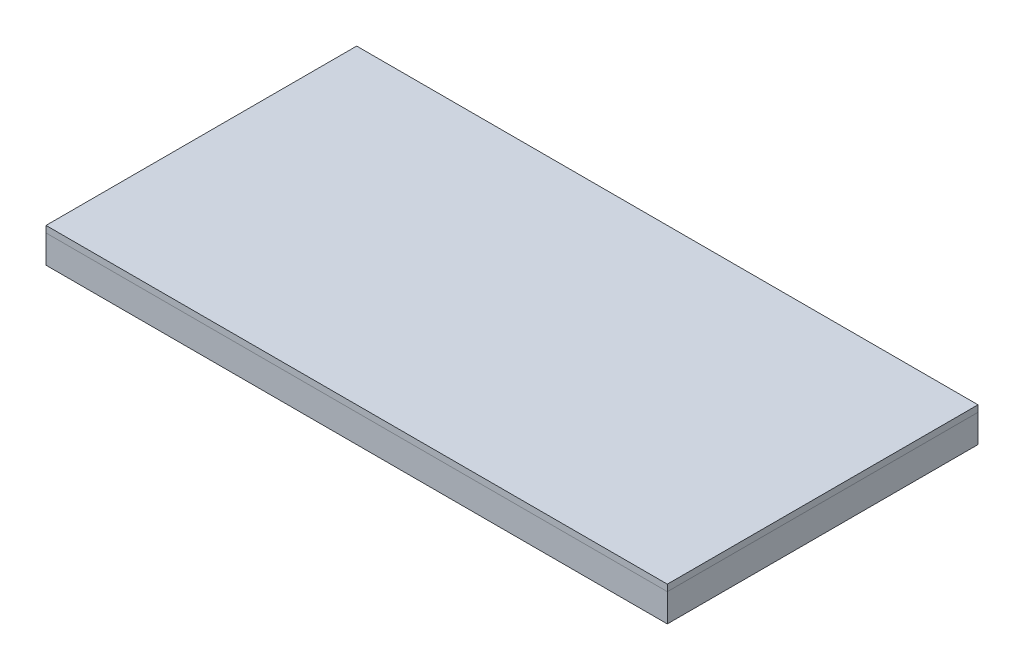
ISO-10303-21;
HEADER;
FILE_DESCRIPTION(('STEP AP214'),'2;1');
FILE_NAME('part.step','',(''),(''),'','','');
FILE_SCHEMA(('AUTOMOTIVE_DESIGN { 1 0 10303 214 1 1 1 1 }'));
ENDSEC;
DATA;
#1=APPLICATION_CONTEXT('core data for automotive mechanical design processes');
#2=APPLICATION_PROTOCOL_DEFINITION('international standard','automotive_design',2000,#1);
#3=PRODUCT_CONTEXT('',#1,'mechanical');
#4=PRODUCT('Part','Part','',(#3));
#5=PRODUCT_RELATED_PRODUCT_CATEGORY('part','',(#4));
#6=PRODUCT_DEFINITION_FORMATION('','',#4);
#7=PRODUCT_DEFINITION_CONTEXT('part definition',#1,'design');
#8=PRODUCT_DEFINITION('design','',#6,#7);
#9=PRODUCT_DEFINITION_SHAPE('','',#8);
#10=(LENGTH_UNIT() NAMED_UNIT(*) SI_UNIT(.MILLI.,.METRE.));
#11=(NAMED_UNIT(*) PLANE_ANGLE_UNIT() SI_UNIT($,.RADIAN.));
#12=(NAMED_UNIT(*) SI_UNIT($,.STERADIAN.) SOLID_ANGLE_UNIT());
#13=UNCERTAINTY_MEASURE_WITH_UNIT(LENGTH_MEASURE(1.E-05),#10,'distance_accuracy_value','');
#14=(GEOMETRIC_REPRESENTATION_CONTEXT(3) GLOBAL_UNCERTAINTY_ASSIGNED_CONTEXT((#13)) GLOBAL_UNIT_ASSIGNED_CONTEXT((#10,
#11,#12)) REPRESENTATION_CONTEXT('',''));
#15=CARTESIAN_POINT('',(0.,0.,0.));
#16=DIRECTION('',(0.,0.,1.));
#17=DIRECTION('',(1.,0.,0.));
#18=AXIS2_PLACEMENT_3D('',#15,#16,#17);
#19=CARTESIAN_POINT('',(0.,-111.,0.));
#20=DIRECTION('',(0.,-1.,0.));
#21=DIRECTION('',(0.,0.,-1.));
#22=AXIS2_PLACEMENT_3D('',#19,#20,#21);
#23=PLANE('',#22);
#24=DIRECTION('',(1.,0.,0.));
#25=VECTOR('',#24,1.);
#26=CARTESIAN_POINT('',(-1000.,-111.,-500.));
#27=LINE('',#26,#25);
#28=CARTESIAN_POINT('',(-1000.,-111.,-500.));
#29=VERTEX_POINT('',#28);
#30=CARTESIAN_POINT('',(1000.,-111.,-500.));
#31=VERTEX_POINT('',#30);
#32=EDGE_CURVE('E143',#29,#31,#27,.T.);
#33=ORIENTED_EDGE('',*,*,#32,.T.);
#34=DIRECTION('',(0.,0.,1.));
#35=VECTOR('',#34,1.);
#36=CARTESIAN_POINT('',(1000.,-111.,-500.));
#37=LINE('',#36,#35);
#38=CARTESIAN_POINT('',(1000.,-111.,500.));
#39=VERTEX_POINT('',#38);
#40=EDGE_CURVE('E146',#31,#39,#37,.T.);
#41=ORIENTED_EDGE('',*,*,#40,.T.);
#42=DIRECTION('',(-1.,0.,0.));
#43=VECTOR('',#42,1.);
#44=CARTESIAN_POINT('',(1000.,-111.,500.));
#45=LINE('',#44,#43);
#46=CARTESIAN_POINT('',(-1000.,-111.,500.));
#47=VERTEX_POINT('',#46);
#48=EDGE_CURVE('E149',#39,#47,#45,.T.);
#49=ORIENTED_EDGE('',*,*,#48,.T.);
#50=DIRECTION('',(0.,0.,-1.));
#51=VECTOR('',#50,1.);
#52=CARTESIAN_POINT('',(-1000.,-111.,500.));
#53=LINE('',#52,#51);
#54=EDGE_CURVE('E151',#47,#29,#53,.T.);
#55=ORIENTED_EDGE('',*,*,#54,.T.);
#56=EDGE_LOOP('',(#33,#41,#49,#55));
#57=FACE_BOUND('',#56,.T.);
#58=DIRECTION('',(0.,0.,1.));
#59=VECTOR('',#58,1.);
#60=CARTESIAN_POINT('',(910.,-111.,-410.));
#61=LINE('',#60,#59);
#62=CARTESIAN_POINT('',(910.,-111.,-410.));
#63=VERTEX_POINT('',#62);
#64=CARTESIAN_POINT('',(910.,-111.,410.));
#65=VERTEX_POINT('',#64);
#66=EDGE_CURVE('E115',#63,#65,#61,.T.);
#67=ORIENTED_EDGE('',*,*,#66,.F.);
#68=DIRECTION('',(1.,0.,0.));
#69=VECTOR('',#68,1.);
#70=CARTESIAN_POINT('',(-910.,-111.,-410.));
#71=LINE('',#70,#69);
#72=CARTESIAN_POINT('',(-910.,-111.,-410.));
#73=VERTEX_POINT('',#72);
#74=EDGE_CURVE('E107',#73,#63,#71,.T.);
#75=ORIENTED_EDGE('',*,*,#74,.F.);
#76=DIRECTION('',(0.,0.,-1.));
#77=VECTOR('',#76,1.);
#78=CARTESIAN_POINT('',(-910.,-111.,410.));
#79=LINE('',#78,#77);
#80=CARTESIAN_POINT('',(-910.,-111.,410.));
#81=VERTEX_POINT('',#80);
#82=EDGE_CURVE('E129',#81,#73,#79,.T.);
#83=ORIENTED_EDGE('',*,*,#82,.F.);
#84=DIRECTION('',(-1.,0.,0.));
#85=VECTOR('',#84,1.);
#86=CARTESIAN_POINT('',(910.,-111.,410.));
#87=LINE('',#86,#85);
#88=EDGE_CURVE('E127',#65,#81,#87,.T.);
#89=ORIENTED_EDGE('',*,*,#88,.F.);
#90=EDGE_LOOP('',(#67,#75,#83,#89));
#91=FACE_BOUND('',#90,.T.);
#92=ADVANCED_FACE('F42',(#57,#91),#23,.T.);
#93=CARTESIAN_POINT('',(0.,-21.,0.));
#94=DIRECTION('',(0.,-1.,0.));
#95=DIRECTION('',(0.,0.,-1.));
#96=AXIS2_PLACEMENT_3D('',#93,#94,#95);
#97=PLANE('',#96);
#98=DIRECTION('',(1.,0.,0.));
#99=VECTOR('',#98,1.);
#100=CARTESIAN_POINT('',(-1000.,-21.,-500.));
#101=LINE('',#100,#99);
#102=CARTESIAN_POINT('',(-1000.,-21.,-500.));
#103=VERTEX_POINT('',#102);
#104=CARTESIAN_POINT('',(1000.,-21.,-500.));
#105=VERTEX_POINT('',#104);
#106=EDGE_CURVE('E123',#103,#105,#101,.T.);
#107=ORIENTED_EDGE('',*,*,#106,.F.);
#108=DIRECTION('',(0.,0.,-1.));
#109=VECTOR('',#108,1.);
#110=CARTESIAN_POINT('',(-1000.,-21.,500.));
#111=LINE('',#110,#109);
#112=CARTESIAN_POINT('',(-1000.,-21.,500.));
#113=VERTEX_POINT('',#112);
#114=EDGE_CURVE('E147',#113,#103,#111,.T.);
#115=ORIENTED_EDGE('',*,*,#114,.F.);
#116=DIRECTION('',(-1.,0.,0.));
#117=VECTOR('',#116,1.);
#118=CARTESIAN_POINT('',(1000.,-21.,500.));
#119=LINE('',#118,#117);
#120=CARTESIAN_POINT('',(1000.,-21.,500.));
#121=VERTEX_POINT('',#120);
#122=EDGE_CURVE('E158',#121,#113,#119,.T.);
#123=ORIENTED_EDGE('',*,*,#122,.F.);
#124=DIRECTION('',(0.,0.,1.));
#125=VECTOR('',#124,1.);
#126=CARTESIAN_POINT('',(1000.,-21.,-500.));
#127=LINE('',#126,#125);
#128=EDGE_CURVE('E156',#105,#121,#127,.T.);
#129=ORIENTED_EDGE('',*,*,#128,.F.);
#130=EDGE_LOOP('',(#107,#115,#123,#129));
#131=FACE_BOUND('',#130,.T.);
#132=DIRECTION('',(1.,0.,0.));
#133=VECTOR('',#132,1.);
#134=CARTESIAN_POINT('',(-910.,-21.,-410.));
#135=LINE('',#134,#133);
#136=CARTESIAN_POINT('',(-910.,-21.,-410.));
#137=VERTEX_POINT('',#136);
#138=CARTESIAN_POINT('',(910.,-21.,-410.));
#139=VERTEX_POINT('',#138);
#140=EDGE_CURVE('E65',#137,#139,#135,.T.);
#141=ORIENTED_EDGE('',*,*,#140,.T.);
#142=DIRECTION('',(0.,0.,1.));
#143=VECTOR('',#142,1.);
#144=CARTESIAN_POINT('',(910.,-21.,-410.));
#145=LINE('',#144,#143);
#146=CARTESIAN_POINT('',(910.,-21.,410.));
#147=VERTEX_POINT('',#146);
#148=EDGE_CURVE('E122',#139,#147,#145,.T.);
#149=ORIENTED_EDGE('',*,*,#148,.T.);
#150=DIRECTION('',(-1.,0.,0.));
#151=VECTOR('',#150,1.);
#152=CARTESIAN_POINT('',(910.,-21.,410.));
#153=LINE('',#152,#151);
#154=CARTESIAN_POINT('',(-910.,-21.,410.));
#155=VERTEX_POINT('',#154);
#156=EDGE_CURVE('E135',#147,#155,#153,.T.);
#157=ORIENTED_EDGE('',*,*,#156,.T.);
#158=DIRECTION('',(0.,0.,-1.));
#159=VECTOR('',#158,1.);
#160=CARTESIAN_POINT('',(-910.,-21.,410.));
#161=LINE('',#160,#159);
#162=EDGE_CURVE('E116',#155,#137,#161,.T.);
#163=ORIENTED_EDGE('',*,*,#162,.T.);
#164=EDGE_LOOP('',(#141,#149,#157,#163));
#165=FACE_BOUND('',#164,.T.);
#166=ADVANCED_FACE('F176',(#131,#165),#97,.F.);
#167=CARTESIAN_POINT('',(-1000.,-111.,-500.));
#168=DIRECTION('',(0.,0.,1.));
#169=DIRECTION('',(1.,0.,0.));
#170=AXIS2_PLACEMENT_3D('',#167,#168,#169);
#171=PLANE('',#170);
#172=ORIENTED_EDGE('',*,*,#106,.T.);
#173=DIRECTION('',(0.,1.,0.));
#174=VECTOR('',#173,1.);
#175=CARTESIAN_POINT('',(1000.,-111.,-500.));
#176=LINE('',#175,#174);
#177=EDGE_CURVE('E12',#31,#105,#176,.T.);
#178=ORIENTED_EDGE('',*,*,#177,.F.);
#179=ORIENTED_EDGE('',*,*,#32,.F.);
#180=DIRECTION('',(0.,1.,0.));
#181=VECTOR('',#180,1.);
#182=CARTESIAN_POINT('',(-1000.,-111.,-500.));
#183=LINE('',#182,#181);
#184=EDGE_CURVE('E153',#29,#103,#183,.T.);
#185=ORIENTED_EDGE('',*,*,#184,.T.);
#186=EDGE_LOOP('',(#172,#178,#179,#185));
#187=FACE_BOUND('',#186,.T.);
#188=ADVANCED_FACE('F44',(#187),#171,.F.);
#189=CARTESIAN_POINT('',(1000.,-111.,-500.));
#190=DIRECTION('',(-1.,0.,0.));
#191=DIRECTION('',(0.,0.,1.));
#192=AXIS2_PLACEMENT_3D('',#189,#190,#191);
#193=PLANE('',#192);
#194=ORIENTED_EDGE('',*,*,#128,.T.);
#195=DIRECTION('',(0.,1.,0.));
#196=VECTOR('',#195,1.);
#197=CARTESIAN_POINT('',(1000.,-111.,500.));
#198=LINE('',#197,#196);
#199=EDGE_CURVE('E50',#39,#121,#198,.T.);
#200=ORIENTED_EDGE('',*,*,#199,.F.);
#201=ORIENTED_EDGE('',*,*,#40,.F.);
#202=ORIENTED_EDGE('',*,*,#177,.T.);
#203=EDGE_LOOP('',(#194,#200,#201,#202));
#204=FACE_BOUND('',#203,.T.);
#205=ADVANCED_FACE('F186',(#204),#193,.F.);
#206=CARTESIAN_POINT('',(1000.,-111.,500.));
#207=DIRECTION('',(0.,0.,-1.));
#208=DIRECTION('',(-1.,0.,0.));
#209=AXIS2_PLACEMENT_3D('',#206,#207,#208);
#210=PLANE('',#209);
#211=ORIENTED_EDGE('',*,*,#122,.T.);
#212=DIRECTION('',(0.,1.,0.));
#213=VECTOR('',#212,1.);
#214=CARTESIAN_POINT('',(-1000.,-111.,500.));
#215=LINE('',#214,#213);
#216=EDGE_CURVE('E163',#47,#113,#215,.T.);
#217=ORIENTED_EDGE('',*,*,#216,.F.);
#218=ORIENTED_EDGE('',*,*,#48,.F.);
#219=ORIENTED_EDGE('',*,*,#199,.T.);
#220=EDGE_LOOP('',(#211,#217,#218,#219));
#221=FACE_BOUND('',#220,.T.);
#222=ADVANCED_FACE('F170',(#221),#210,.F.);
#223=CARTESIAN_POINT('',(-1000.,-111.,500.));
#224=DIRECTION('',(1.,0.,0.));
#225=DIRECTION('',(0.,0.,-1.));
#226=AXIS2_PLACEMENT_3D('',#223,#224,#225);
#227=PLANE('',#226);
#228=ORIENTED_EDGE('',*,*,#114,.T.);
#229=ORIENTED_EDGE('',*,*,#184,.F.);
#230=ORIENTED_EDGE('',*,*,#54,.F.);
#231=ORIENTED_EDGE('',*,*,#216,.T.);
#232=EDGE_LOOP('',(#228,#229,#230,#231));
#233=FACE_BOUND('',#232,.T.);
#234=ADVANCED_FACE('F180',(#233),#227,.F.);
#235=CARTESIAN_POINT('',(-910.,-111.,-410.));
#236=DIRECTION('',(0.,0.,1.));
#237=DIRECTION('',(1.,0.,0.));
#238=AXIS2_PLACEMENT_3D('',#235,#236,#237);
#239=PLANE('',#238);
#240=ORIENTED_EDGE('',*,*,#140,.F.);
#241=DIRECTION('',(0.,1.,0.));
#242=VECTOR('',#241,1.);
#243=CARTESIAN_POINT('',(-910.,-111.,-410.));
#244=LINE('',#243,#242);
#245=EDGE_CURVE('E111',#73,#137,#244,.T.);
#246=ORIENTED_EDGE('',*,*,#245,.F.);
#247=ORIENTED_EDGE('',*,*,#74,.T.);
#248=DIRECTION('',(0.,1.,0.));
#249=VECTOR('',#248,1.);
#250=CARTESIAN_POINT('',(910.,-111.,-410.));
#251=LINE('',#250,#249);
#252=EDGE_CURVE('E110',#63,#139,#251,.T.);
#253=ORIENTED_EDGE('',*,*,#252,.T.);
#254=EDGE_LOOP('',(#240,#246,#247,#253));
#255=FACE_BOUND('',#254,.T.);
#256=ADVANCED_FACE('F109',(#255),#239,.T.);
#257=CARTESIAN_POINT('',(910.,-111.,-410.));
#258=DIRECTION('',(-1.,0.,0.));
#259=DIRECTION('',(0.,0.,1.));
#260=AXIS2_PLACEMENT_3D('',#257,#258,#259);
#261=PLANE('',#260);
#262=ORIENTED_EDGE('',*,*,#148,.F.);
#263=ORIENTED_EDGE('',*,*,#252,.F.);
#264=ORIENTED_EDGE('',*,*,#66,.T.);
#265=DIRECTION('',(0.,1.,0.));
#266=VECTOR('',#265,1.);
#267=CARTESIAN_POINT('',(910.,-111.,410.));
#268=LINE('',#267,#266);
#269=EDGE_CURVE('E124',#65,#147,#268,.T.);
#270=ORIENTED_EDGE('',*,*,#269,.T.);
#271=EDGE_LOOP('',(#262,#263,#264,#270));
#272=FACE_BOUND('',#271,.T.);
#273=ADVANCED_FACE('F119',(#272),#261,.T.);
#274=CARTESIAN_POINT('',(910.,-111.,410.));
#275=DIRECTION('',(0.,0.,-1.));
#276=DIRECTION('',(-1.,0.,0.));
#277=AXIS2_PLACEMENT_3D('',#274,#275,#276);
#278=PLANE('',#277);
#279=ORIENTED_EDGE('',*,*,#156,.F.);
#280=ORIENTED_EDGE('',*,*,#269,.F.);
#281=ORIENTED_EDGE('',*,*,#88,.T.);
#282=DIRECTION('',(0.,1.,0.));
#283=VECTOR('',#282,1.);
#284=CARTESIAN_POINT('',(-910.,-111.,410.));
#285=LINE('',#284,#283);
#286=EDGE_CURVE('E57',#81,#155,#285,.T.);
#287=ORIENTED_EDGE('',*,*,#286,.T.);
#288=EDGE_LOOP('',(#279,#280,#281,#287));
#289=FACE_BOUND('',#288,.T.);
#290=ADVANCED_FACE('F209',(#289),#278,.T.);
#291=CARTESIAN_POINT('',(-910.,-111.,410.));
#292=DIRECTION('',(1.,0.,0.));
#293=DIRECTION('',(0.,0.,-1.));
#294=AXIS2_PLACEMENT_3D('',#291,#292,#293);
#295=PLANE('',#294);
#296=ORIENTED_EDGE('',*,*,#162,.F.);
#297=ORIENTED_EDGE('',*,*,#286,.F.);
#298=ORIENTED_EDGE('',*,*,#82,.T.);
#299=ORIENTED_EDGE('',*,*,#245,.T.);
#300=EDGE_LOOP('',(#296,#297,#298,#299));
#301=FACE_BOUND('',#300,.T.);
#302=ADVANCED_FACE('F213',(#301),#295,.T.);
#303=CLOSED_SHELL('',(#92,#166,#188,#205,#222,#234,#256,#273,#290,#302));
#304=MANIFOLD_SOLID_BREP('B2',#303);
#305=CARTESIAN_POINT('',(1000.,-21.,500.));
#306=DIRECTION('',(1.,0.,0.));
#307=DIRECTION('',(0.,0.,-1.));
#308=AXIS2_PLACEMENT_3D('',#305,#306,#307);
#309=PLANE('',#308);
#310=DIRECTION('',(0.,0.,-1.));
#311=VECTOR('',#310,1.);
#312=CARTESIAN_POINT('',(1000.,0.,500.));
#313=LINE('',#312,#311);
#314=CARTESIAN_POINT('',(1000.,0.,500.));
#315=VERTEX_POINT('',#314);
#316=CARTESIAN_POINT('',(1000.,0.,-500.));
#317=VERTEX_POINT('',#316);
#318=EDGE_CURVE('E335',#315,#317,#313,.T.);
#319=ORIENTED_EDGE('',*,*,#318,.F.);
#320=DIRECTION('',(0.,1.,0.));
#321=VECTOR('',#320,1.);
#322=CARTESIAN_POINT('',(1000.,-21.,500.));
#323=LINE('',#322,#321);
#324=CARTESIAN_POINT('',(1000.,-21.,500.));
#325=VERTEX_POINT('',#324);
#326=EDGE_CURVE('E40',#325,#315,#323,.T.);
#327=ORIENTED_EDGE('',*,*,#326,.F.);
#328=DIRECTION('',(0.,0.,-1.));
#329=VECTOR('',#328,1.);
#330=CARTESIAN_POINT('',(1000.,-21.,500.));
#331=LINE('',#330,#329);
#332=CARTESIAN_POINT('',(1000.,-21.,-500.));
#333=VERTEX_POINT('',#332);
#334=EDGE_CURVE('E329',#325,#333,#331,.T.);
#335=ORIENTED_EDGE('',*,*,#334,.T.);
#336=DIRECTION('',(0.,1.,0.));
#337=VECTOR('',#336,1.);
#338=CARTESIAN_POINT('',(1000.,-21.,-500.));
#339=LINE('',#338,#337);
#340=EDGE_CURVE('E274',#333,#317,#339,.T.);
#341=ORIENTED_EDGE('',*,*,#340,.T.);
#342=EDGE_LOOP('',(#319,#327,#335,#341));
#343=FACE_BOUND('',#342,.T.);
#344=ADVANCED_FACE('F271',(#343),#309,.T.);
#345=CARTESIAN_POINT('',(-1000.,-21.,500.));
#346=DIRECTION('',(0.,0.,1.));
#347=DIRECTION('',(1.,0.,0.));
#348=AXIS2_PLACEMENT_3D('',#345,#346,#347);
#349=PLANE('',#348);
#350=DIRECTION('',(1.,0.,0.));
#351=VECTOR('',#350,1.);
#352=CARTESIAN_POINT('',(-1000.,0.,500.));
#353=LINE('',#352,#351);
#354=CARTESIAN_POINT('',(-1000.,0.,500.));
#355=VERTEX_POINT('',#354);
#356=EDGE_CURVE('E331',#355,#315,#353,.T.);
#357=ORIENTED_EDGE('',*,*,#356,.F.);
#358=DIRECTION('',(0.,1.,0.));
#359=VECTOR('',#358,1.);
#360=CARTESIAN_POINT('',(-1000.,-21.,500.));
#361=LINE('',#360,#359);
#362=CARTESIAN_POINT('',(-1000.,-21.,500.));
#363=VERTEX_POINT('',#362);
#364=EDGE_CURVE('E280',#363,#355,#361,.T.);
#365=ORIENTED_EDGE('',*,*,#364,.F.);
#366=DIRECTION('',(1.,0.,0.));
#367=VECTOR('',#366,1.);
#368=CARTESIAN_POINT('',(-1000.,-21.,500.));
#369=LINE('',#368,#367);
#370=EDGE_CURVE('E326',#363,#325,#369,.T.);
#371=ORIENTED_EDGE('',*,*,#370,.T.);
#372=ORIENTED_EDGE('',*,*,#326,.T.);
#373=EDGE_LOOP('',(#357,#365,#371,#372));
#374=FACE_BOUND('',#373,.T.);
#375=ADVANCED_FACE('F345',(#374),#349,.T.);
#376=CARTESIAN_POINT('',(-1000.,-21.,500.));
#377=DIRECTION('',(-1.,0.,0.));
#378=DIRECTION('',(0.,0.,1.));
#379=AXIS2_PLACEMENT_3D('',#376,#377,#378);
#380=PLANE('',#379);
#381=DIRECTION('',(0.,0.,1.));
#382=VECTOR('',#381,1.);
#383=CARTESIAN_POINT('',(-1000.,0.,500.));
#384=LINE('',#383,#382);
#385=CARTESIAN_POINT('',(-1000.,0.,-500.));
#386=VERTEX_POINT('',#385);
#387=EDGE_CURVE('E321',#386,#355,#384,.T.);
#388=ORIENTED_EDGE('',*,*,#387,.F.);
#389=DIRECTION('',(0.,1.,0.));
#390=VECTOR('',#389,1.);
#391=CARTESIAN_POINT('',(-1000.,-21.,-500.));
#392=LINE('',#391,#390);
#393=CARTESIAN_POINT('',(-1000.,-21.,-500.));
#394=VERTEX_POINT('',#393);
#395=EDGE_CURVE('E316',#394,#386,#392,.T.);
#396=ORIENTED_EDGE('',*,*,#395,.F.);
#397=DIRECTION('',(0.,0.,1.));
#398=VECTOR('',#397,1.);
#399=CARTESIAN_POINT('',(-1000.,-21.,500.));
#400=LINE('',#399,#398);
#401=EDGE_CURVE('E319',#394,#363,#400,.T.);
#402=ORIENTED_EDGE('',*,*,#401,.T.);
#403=ORIENTED_EDGE('',*,*,#364,.T.);
#404=EDGE_LOOP('',(#388,#396,#402,#403));
#405=FACE_BOUND('',#404,.T.);
#406=ADVANCED_FACE('F318',(#405),#380,.T.);
#407=CARTESIAN_POINT('',(-1000.,-21.,-500.));
#408=DIRECTION('',(0.,0.,-1.));
#409=DIRECTION('',(-1.,0.,0.));
#410=AXIS2_PLACEMENT_3D('',#407,#408,#409);
#411=PLANE('',#410);
#412=DIRECTION('',(-1.,0.,0.));
#413=VECTOR('',#412,1.);
#414=CARTESIAN_POINT('',(-1000.,0.,-500.));
#415=LINE('',#414,#413);
#416=EDGE_CURVE('E338',#317,#386,#415,.T.);
#417=ORIENTED_EDGE('',*,*,#416,.F.);
#418=ORIENTED_EDGE('',*,*,#340,.F.);
#419=DIRECTION('',(-1.,0.,0.));
#420=VECTOR('',#419,1.);
#421=CARTESIAN_POINT('',(-1000.,-21.,-500.));
#422=LINE('',#421,#420);
#423=EDGE_CURVE('E325',#333,#394,#422,.T.);
#424=ORIENTED_EDGE('',*,*,#423,.T.);
#425=ORIENTED_EDGE('',*,*,#395,.T.);
#426=EDGE_LOOP('',(#417,#418,#424,#425));
#427=FACE_BOUND('',#426,.T.);
#428=ADVANCED_FACE('F328',(#427),#411,.T.);
#429=CARTESIAN_POINT('',(0.,-21.,0.));
#430=DIRECTION('',(0.,-1.,0.));
#431=DIRECTION('',(0.,0.,-1.));
#432=AXIS2_PLACEMENT_3D('',#429,#430,#431);
#433=PLANE('',#432);
#434=ORIENTED_EDGE('',*,*,#334,.F.);
#435=ORIENTED_EDGE('',*,*,#370,.F.);
#436=ORIENTED_EDGE('',*,*,#401,.F.);
#437=ORIENTED_EDGE('',*,*,#423,.F.);
#438=EDGE_LOOP('',(#434,#435,#436,#437));
#439=FACE_BOUND('',#438,.T.);
#440=ADVANCED_FACE('F324',(#439),#433,.T.);
#441=CARTESIAN_POINT('',(0.,0.,0.));
#442=DIRECTION('',(0.,-1.,0.));
#443=DIRECTION('',(0.,0.,-1.));
#444=AXIS2_PLACEMENT_3D('',#441,#442,#443);
#445=PLANE('',#444);
#446=ORIENTED_EDGE('',*,*,#318,.T.);
#447=ORIENTED_EDGE('',*,*,#416,.T.);
#448=ORIENTED_EDGE('',*,*,#387,.T.);
#449=ORIENTED_EDGE('',*,*,#356,.T.);
#450=EDGE_LOOP('',(#446,#447,#448,#449));
#451=FACE_BOUND('',#450,.T.);
#452=ADVANCED_FACE('F344',(#451),#445,.F.);
#453=CLOSED_SHELL('',(#344,#375,#406,#428,#440,#452));
#454=MANIFOLD_SOLID_BREP('B6',#453);
#455=ADVANCED_BREP_SHAPE_REPRESENTATION('',(#18,#304,#454),#14);
#456=SHAPE_DEFINITION_REPRESENTATION(#9,#455);
ENDSEC;
END-ISO-10303-21;
